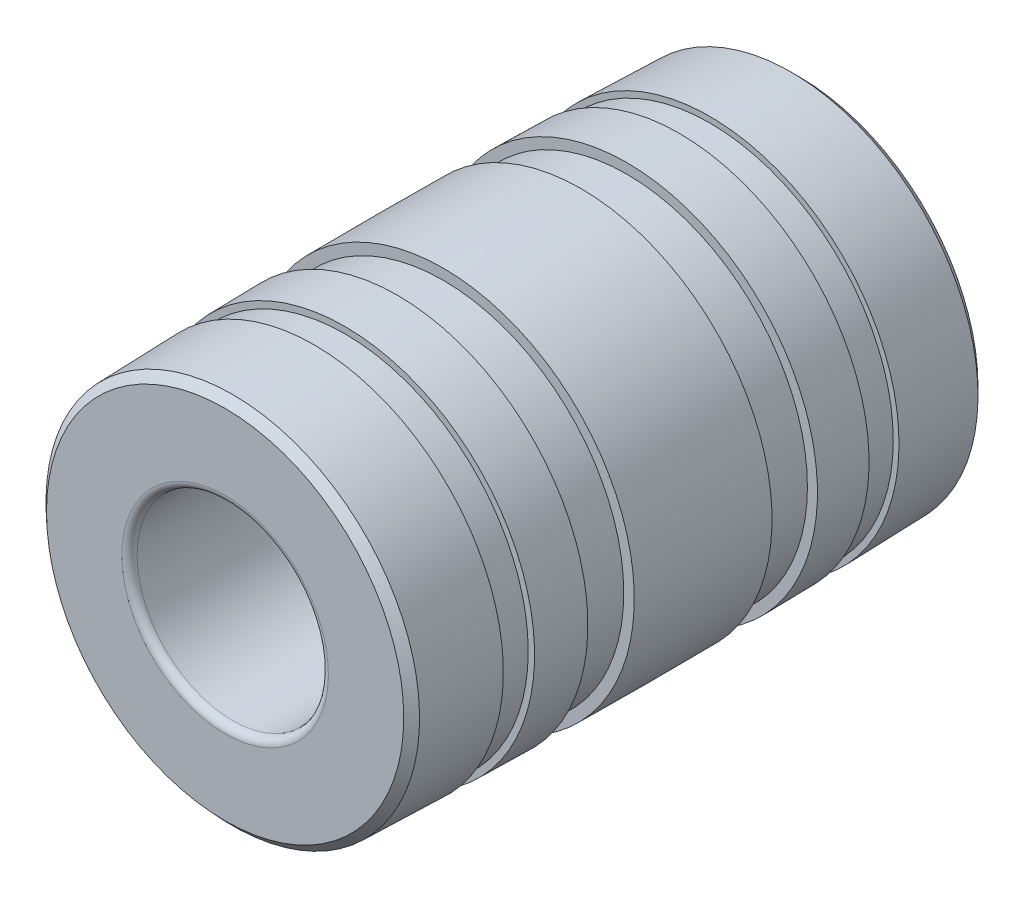
ISO-10303-21;
HEADER;
FILE_DESCRIPTION(('STEP AP214'),'2;1');
FILE_NAME('part.step','',(''),(''),'','','');
FILE_SCHEMA(('AUTOMOTIVE_DESIGN { 1 0 10303 214 1 1 1 1 }'));
ENDSEC;
DATA;
#1=APPLICATION_CONTEXT('core data for automotive mechanical design processes');
#2=APPLICATION_PROTOCOL_DEFINITION('international standard','automotive_design',2000,#1);
#3=PRODUCT_CONTEXT('',#1,'mechanical');
#4=PRODUCT('Part','Part','',(#3));
#5=PRODUCT_RELATED_PRODUCT_CATEGORY('part','',(#4));
#6=PRODUCT_DEFINITION_FORMATION('','',#4);
#7=PRODUCT_DEFINITION_CONTEXT('part definition',#1,'design');
#8=PRODUCT_DEFINITION('design','',#6,#7);
#9=PRODUCT_DEFINITION_SHAPE('','',#8);
#10=(LENGTH_UNIT() NAMED_UNIT(*) SI_UNIT(.MILLI.,.METRE.));
#11=(NAMED_UNIT(*) PLANE_ANGLE_UNIT() SI_UNIT($,.RADIAN.));
#12=(NAMED_UNIT(*) SI_UNIT($,.STERADIAN.) SOLID_ANGLE_UNIT());
#13=UNCERTAINTY_MEASURE_WITH_UNIT(LENGTH_MEASURE(1.E-05),#10,'distance_accuracy_value','');
#14=(GEOMETRIC_REPRESENTATION_CONTEXT(3) GLOBAL_UNCERTAINTY_ASSIGNED_CONTEXT((#13)) GLOBAL_UNIT_ASSIGNED_CONTEXT((#10,
#11,#12)) REPRESENTATION_CONTEXT('',''));
#15=CARTESIAN_POINT('',(0.,0.,0.));
#16=DIRECTION('',(0.,0.,1.));
#17=DIRECTION('',(1.,0.,0.));
#18=AXIS2_PLACEMENT_3D('',#15,#16,#17);
#19=CARTESIAN_POINT('',(0.,0.,9.52499999999993));
#20=DIRECTION('',(0.,0.,1.));
#21=DIRECTION('',(0.,-1.,0.));
#22=AXIS2_PLACEMENT_3D('',#19,#20,#21);
#23=PLANE('',#22);
#24=CARTESIAN_POINT('',(0.,0.,9.52499999999993));
#25=DIRECTION('',(0.,0.,1.));
#26=DIRECTION('',(0.,-1.,0.));
#27=AXIS2_PLACEMENT_3D('',#24,#25,#26);
#28=CIRCLE('',#27,3.429);
#29=CARTESIAN_POINT('',(0.,-3.429,9.52499999999993));
#30=VERTEX_POINT('',#29);
#31=EDGE_CURVE('E10',#30,#30,#28,.F.);
#32=ORIENTED_EDGE('',*,*,#31,.T.);
#33=EDGE_LOOP('',(#32));
#34=FACE_BOUND('',#33,.T.);
#35=CARTESIAN_POINT('',(0.,0.,9.52499999999993));
#36=DIRECTION('',(0.,0.,1.));
#37=DIRECTION('',(0.,-1.,0.));
#38=AXIS2_PLACEMENT_3D('',#35,#36,#37);
#39=CIRCLE('',#38,5.92834284277033);
#40=CARTESIAN_POINT('',(0.,-5.92834284277032,9.52499999999993));
#41=VERTEX_POINT('',#40);
#42=EDGE_CURVE('E55',#41,#41,#39,.T.);
#43=ORIENTED_EDGE('',*,*,#42,.T.);
#44=EDGE_LOOP('',(#43));
#45=FACE_BOUND('',#44,.T.);
#46=ADVANCED_FACE('F32',(#34,#45),#23,.T.);
#47=CARTESIAN_POINT('',(0.,0.,-9.525));
#48=DIRECTION('',(0.,0.,-1.));
#49=DIRECTION('',(0.,1.,0.));
#50=AXIS2_PLACEMENT_3D('',#47,#48,#49);
#51=PLANE('',#50);
#52=CARTESIAN_POINT('',(0.,0.,-9.525));
#53=DIRECTION('',(0.,0.,-1.));
#54=DIRECTION('',(0.,1.,0.));
#55=AXIS2_PLACEMENT_3D('',#52,#53,#54);
#56=CIRCLE('',#55,3.429);
#57=CARTESIAN_POINT('',(0.,3.429,-9.525));
#58=VERTEX_POINT('',#57);
#59=EDGE_CURVE('E47',#58,#58,#56,.F.);
#60=ORIENTED_EDGE('',*,*,#59,.T.);
#61=EDGE_LOOP('',(#60));
#62=FACE_BOUND('',#61,.T.);
#63=CARTESIAN_POINT('',(0.,0.,-9.525));
#64=DIRECTION('',(0.,0.,-1.));
#65=DIRECTION('',(0.,1.,0.));
#66=AXIS2_PLACEMENT_3D('',#63,#64,#65);
#67=CIRCLE('',#66,5.93725000000012);
#68=CARTESIAN_POINT('',(0.,5.93725000000011,-9.525));
#69=VERTEX_POINT('',#68);
#70=EDGE_CURVE('E58',#69,#69,#67,.T.);
#71=ORIENTED_EDGE('',*,*,#70,.T.);
#72=EDGE_LOOP('',(#71));
#73=FACE_BOUND('',#72,.T.);
#74=ADVANCED_FACE('F131',(#62,#73),#51,.T.);
#75=CARTESIAN_POINT('',(0.,0.,1.64659045136589E-13));
#76=DIRECTION('',(0.,0.,1.));
#77=DIRECTION('',(0.,-1.,0.));
#78=AXIS2_PLACEMENT_3D('',#75,#76,#77);
#79=DEGENERATE_TOROIDAL_SURFACE('',#78,279.479375000001,285.829375,.F.);
#80=CARTESIAN_POINT('',(0.,0.,-9.26236389053507));
#81=DIRECTION('',(0.,0.,1.));
#82=DIRECTION('',(0.,-1.,0.));
#83=AXIS2_PLACEMENT_3D('',#80,#81,#82);
#84=CIRCLE('',#83,6.199886109465);
#85=CARTESIAN_POINT('',(0.,-6.199886109465,-9.26236389053507));
#86=VERTEX_POINT('',#85);
#87=EDGE_CURVE('E61',#86,#86,#84,.T.);
#88=ORIENTED_EDGE('',*,*,#87,.T.);
#89=EDGE_LOOP('',(#88));
#90=FACE_BOUND('',#89,.T.);
#91=CARTESIAN_POINT('',(0.,0.,-6.56589999999983));
#92=DIRECTION('',(0.,0.,1.));
#93=DIRECTION('',(0.,-1.,0.));
#94=AXIS2_PLACEMENT_3D('',#91,#92,#93);
#95=CIRCLE('',#94,6.27457610143373);
#96=CARTESIAN_POINT('',(0.,-6.27457610143375,-6.56589999999982));
#97=VERTEX_POINT('',#96);
#98=EDGE_CURVE('E64',#97,#97,#95,.T.);
#99=ORIENTED_EDGE('',*,*,#98,.F.);
#100=EDGE_LOOP('',(#99));
#101=FACE_BOUND('',#100,.T.);
#102=ADVANCED_FACE('F136',(#90,#101),#79,.F.);
#103=CARTESIAN_POINT('',(0.,6.27457610143366,-6.56589999999992));
#104=DIRECTION('',(0.,0.,1.));
#105=DIRECTION('',(0.,-1.,0.));
#106=AXIS2_PLACEMENT_3D('',#103,#104,#105);
#107=PLANE('',#106);
#108=ORIENTED_EDGE('',*,*,#98,.T.);
#109=EDGE_LOOP('',(#108));
#110=FACE_BOUND('',#109,.T.);
#111=CARTESIAN_POINT('',(0.,0.,-6.5659));
#112=DIRECTION('',(0.,0.,1.));
#113=DIRECTION('',(0.,-1.,0.));
#114=AXIS2_PLACEMENT_3D('',#111,#112,#113);
#115=CIRCLE('',#114,6.08407610143368);
#116=CARTESIAN_POINT('',(0.,-6.08407610143369,-6.5659));
#117=VERTEX_POINT('',#116);
#118=EDGE_CURVE('E67',#117,#117,#115,.T.);
#119=ORIENTED_EDGE('',*,*,#118,.F.);
#120=EDGE_LOOP('',(#119));
#121=FACE_BOUND('',#120,.T.);
#122=ADVANCED_FACE('F165',(#110,#121),#107,.T.);
#123=CARTESIAN_POINT('',(0.,0.,9.525));
#124=DIRECTION('',(0.,0.,1.));
#125=DIRECTION('',(0.,-1.,0.));
#126=AXIS2_PLACEMENT_3D('',#123,#124,#125);
#127=CYLINDRICAL_SURFACE('',#126,6.08407610143368);
#128=ORIENTED_EDGE('',*,*,#118,.T.);
#129=EDGE_LOOP('',(#128));
#130=FACE_BOUND('',#129,.T.);
#131=CARTESIAN_POINT('',(0.,0.,-5.5499));
#132=DIRECTION('',(0.,0.,1.));
#133=DIRECTION('',(0.,-1.,0.));
#134=AXIS2_PLACEMENT_3D('',#131,#132,#133);
#135=CIRCLE('',#134,6.08407610143368);
#136=CARTESIAN_POINT('',(0.,-6.08407610143369,-5.5499));
#137=VERTEX_POINT('',#136);
#138=EDGE_CURVE('E70',#137,#137,#135,.T.);
#139=ORIENTED_EDGE('',*,*,#138,.F.);
#140=EDGE_LOOP('',(#139));
#141=FACE_BOUND('',#140,.T.);
#142=ADVANCED_FACE('F170',(#130,#141),#127,.T.);
#143=CARTESIAN_POINT('',(0.,6.08407610143366,-5.5499));
#144=DIRECTION('',(0.,0.,-1.));
#145=DIRECTION('',(0.,1.,0.));
#146=AXIS2_PLACEMENT_3D('',#143,#144,#145);
#147=PLANE('',#146);
#148=ORIENTED_EDGE('',*,*,#138,.T.);
#149=EDGE_LOOP('',(#148));
#150=FACE_BOUND('',#149,.T.);
#151=CARTESIAN_POINT('',(0.,0.,-5.5499));
#152=DIRECTION('',(0.,0.,1.));
#153=DIRECTION('',(0.,-1.,0.));
#154=AXIS2_PLACEMENT_3D('',#151,#152,#153);
#155=CIRCLE('',#154,6.2961141919189);
#156=CARTESIAN_POINT('',(0.,-6.29611419191891,-5.5499));
#157=VERTEX_POINT('',#156);
#158=EDGE_CURVE('E73',#157,#157,#155,.T.);
#159=ORIENTED_EDGE('',*,*,#158,.F.);
#160=EDGE_LOOP('',(#159));
#161=FACE_BOUND('',#160,.T.);
#162=ADVANCED_FACE('F176',(#150,#161),#147,.T.);
#163=CARTESIAN_POINT('',(0.,0.,1.64659045136589E-13));
#164=DIRECTION('',(0.,0.,1.));
#165=DIRECTION('',(0.,-1.,0.));
#166=AXIS2_PLACEMENT_3D('',#163,#164,#165);
#167=DEGENERATE_TOROIDAL_SURFACE('',#166,279.479375000001,285.829375,.F.);
#168=ORIENTED_EDGE('',*,*,#158,.T.);
#169=EDGE_LOOP('',(#168));
#170=FACE_BOUND('',#169,.T.);
#171=CARTESIAN_POINT('',(0.,0.,-3.80999999999995));
#172=DIRECTION('',(0.,0.,1.));
#173=DIRECTION('',(0.,-1.,0.));
#174=AXIS2_PLACEMENT_3D('',#171,#172,#173);
#175=CIRCLE('',#174,6.32460592554724);
#176=CARTESIAN_POINT('',(0.,-6.32460592554725,-3.80999999999995));
#177=VERTEX_POINT('',#176);
#178=EDGE_CURVE('E76',#177,#177,#175,.T.);
#179=ORIENTED_EDGE('',*,*,#178,.F.);
#180=EDGE_LOOP('',(#179));
#181=FACE_BOUND('',#180,.T.);
#182=ADVANCED_FACE('F182',(#170,#181),#167,.F.);
#183=CARTESIAN_POINT('',(0.,5.9912309255473,-3.80999999999998));
#184=DIRECTION('',(0.,0.,1.));
#185=DIRECTION('',(0.,-1.,0.));
#186=AXIS2_PLACEMENT_3D('',#183,#184,#185);
#187=PLANE('',#186);
#188=ORIENTED_EDGE('',*,*,#178,.T.);
#189=EDGE_LOOP('',(#188));
#190=FACE_BOUND('',#189,.T.);
#191=CARTESIAN_POINT('',(0.,0.,-3.81000000000001));
#192=DIRECTION('',(0.,0.,1.));
#193=DIRECTION('',(0.,-1.,0.));
#194=AXIS2_PLACEMENT_3D('',#191,#192,#193);
#195=CIRCLE('',#194,5.99123092554732);
#196=CARTESIAN_POINT('',(0.,-5.99123092554733,-3.81));
#197=VERTEX_POINT('',#196);
#198=EDGE_CURVE('E79',#197,#197,#195,.T.);
#199=ORIENTED_EDGE('',*,*,#198,.F.);
#200=EDGE_LOOP('',(#199));
#201=FACE_BOUND('',#200,.T.);
#202=ADVANCED_FACE('F188',(#190,#201),#187,.T.);
#203=CARTESIAN_POINT('',(0.,0.,9.525));
#204=DIRECTION('',(0.,0.,1.));
#205=DIRECTION('',(0.,-1.,0.));
#206=AXIS2_PLACEMENT_3D('',#203,#204,#205);
#207=CYLINDRICAL_SURFACE('',#206,5.99123092554732);
#208=ORIENTED_EDGE('',*,*,#198,.T.);
#209=EDGE_LOOP('',(#208));
#210=FACE_BOUND('',#209,.T.);
#211=CARTESIAN_POINT('',(0.,0.,-2.286));
#212=DIRECTION('',(0.,0.,1.));
#213=DIRECTION('',(0.,-1.,0.));
#214=AXIS2_PLACEMENT_3D('',#211,#212,#213);
#215=CIRCLE('',#214,5.99123092554732);
#216=CARTESIAN_POINT('',(0.,-5.99123092554733,-2.286));
#217=VERTEX_POINT('',#216);
#218=EDGE_CURVE('E82',#217,#217,#215,.T.);
#219=ORIENTED_EDGE('',*,*,#218,.F.);
#220=EDGE_LOOP('',(#219));
#221=FACE_BOUND('',#220,.T.);
#222=ADVANCED_FACE('F194',(#210,#221),#207,.T.);
#223=CARTESIAN_POINT('',(0.,6.3408583931076,-2.286));
#224=DIRECTION('',(0.,0.,-1.));
#225=DIRECTION('',(0.,1.,0.));
#226=AXIS2_PLACEMENT_3D('',#223,#224,#225);
#227=PLANE('',#226);
#228=ORIENTED_EDGE('',*,*,#218,.T.);
#229=EDGE_LOOP('',(#228));
#230=FACE_BOUND('',#229,.T.);
#231=CARTESIAN_POINT('',(0.,0.,-2.286));
#232=DIRECTION('',(0.,0.,1.));
#233=DIRECTION('',(0.,-1.,0.));
#234=AXIS2_PLACEMENT_3D('',#231,#232,#233);
#235=CIRCLE('',#234,6.34085839310762);
#236=CARTESIAN_POINT('',(0.,-6.34085839310763,-2.286));
#237=VERTEX_POINT('',#236);
#238=EDGE_CURVE('E85',#237,#237,#235,.T.);
#239=ORIENTED_EDGE('',*,*,#238,.F.);
#240=EDGE_LOOP('',(#239));
#241=FACE_BOUND('',#240,.T.);
#242=ADVANCED_FACE('F200',(#230,#241),#227,.T.);
#243=CARTESIAN_POINT('',(0.,0.,1.64659045136589E-13));
#244=DIRECTION('',(0.,0.,1.));
#245=DIRECTION('',(0.,-1.,0.));
#246=AXIS2_PLACEMENT_3D('',#243,#244,#245);
#247=DEGENERATE_TOROIDAL_SURFACE('',#246,279.479375000001,285.829375,.F.);
#248=ORIENTED_EDGE('',*,*,#238,.T.);
#249=EDGE_LOOP('',(#248));
#250=FACE_BOUND('',#249,.T.);
#251=CARTESIAN_POINT('',(0.,0.,2.28600000000001));
#252=DIRECTION('',(0.,0.,1.));
#253=DIRECTION('',(0.,-1.,0.));
#254=AXIS2_PLACEMENT_3D('',#251,#252,#253);
#255=CIRCLE('',#254,6.34085839310773);
#256=CARTESIAN_POINT('',(0.,-6.34085839310774,2.28600000000002));
#257=VERTEX_POINT('',#256);
#258=EDGE_CURVE('E88',#257,#257,#255,.T.);
#259=ORIENTED_EDGE('',*,*,#258,.F.);
#260=EDGE_LOOP('',(#259));
#261=FACE_BOUND('',#260,.T.);
#262=ADVANCED_FACE('F206',(#250,#261),#247,.F.);
#263=CARTESIAN_POINT('',(0.,5.99123092554731,2.286));
#264=DIRECTION('',(0.,0.,1.));
#265=DIRECTION('',(0.,-1.,0.));
#266=AXIS2_PLACEMENT_3D('',#263,#264,#265);
#267=PLANE('',#266);
#268=ORIENTED_EDGE('',*,*,#258,.T.);
#269=EDGE_LOOP('',(#268));
#270=FACE_BOUND('',#269,.T.);
#271=CARTESIAN_POINT('',(0.,0.,2.286));
#272=DIRECTION('',(0.,0.,1.));
#273=DIRECTION('',(0.,-1.,0.));
#274=AXIS2_PLACEMENT_3D('',#271,#272,#273);
#275=CIRCLE('',#274,5.99123092554732);
#276=CARTESIAN_POINT('',(0.,-5.99123092554733,2.286));
#277=VERTEX_POINT('',#276);
#278=EDGE_CURVE('E91',#277,#277,#275,.T.);
#279=ORIENTED_EDGE('',*,*,#278,.F.);
#280=EDGE_LOOP('',(#279));
#281=FACE_BOUND('',#280,.T.);
#282=ADVANCED_FACE('F212',(#270,#281),#267,.T.);
#283=CARTESIAN_POINT('',(0.,0.,9.525));
#284=DIRECTION('',(0.,0.,1.));
#285=DIRECTION('',(0.,-1.,0.));
#286=AXIS2_PLACEMENT_3D('',#283,#284,#285);
#287=CYLINDRICAL_SURFACE('',#286,5.99123092554732);
#288=ORIENTED_EDGE('',*,*,#278,.T.);
#289=EDGE_LOOP('',(#288));
#290=FACE_BOUND('',#289,.T.);
#291=CARTESIAN_POINT('',(0.,0.,3.81));
#292=DIRECTION('',(0.,0.,1.));
#293=DIRECTION('',(0.,-1.,0.));
#294=AXIS2_PLACEMENT_3D('',#291,#292,#293);
#295=CIRCLE('',#294,5.99123092554732);
#296=CARTESIAN_POINT('',(0.,-5.99123092554733,3.81));
#297=VERTEX_POINT('',#296);
#298=EDGE_CURVE('E94',#297,#297,#295,.T.);
#299=ORIENTED_EDGE('',*,*,#298,.F.);
#300=EDGE_LOOP('',(#299));
#301=FACE_BOUND('',#300,.T.);
#302=ADVANCED_FACE('F218',(#290,#301),#287,.T.);
#303=CARTESIAN_POINT('',(0.,6.32460592554731,3.81));
#304=DIRECTION('',(0.,0.,-1.));
#305=DIRECTION('',(0.,1.,0.));
#306=AXIS2_PLACEMENT_3D('',#303,#304,#305);
#307=PLANE('',#306);
#308=ORIENTED_EDGE('',*,*,#298,.T.);
#309=EDGE_LOOP('',(#308));
#310=FACE_BOUND('',#309,.T.);
#311=CARTESIAN_POINT('',(0.,0.,3.81));
#312=DIRECTION('',(0.,0.,1.));
#313=DIRECTION('',(0.,-1.,0.));
#314=AXIS2_PLACEMENT_3D('',#311,#312,#313);
#315=CIRCLE('',#314,6.32460592554732);
#316=CARTESIAN_POINT('',(0.,-6.32460592554733,3.81));
#317=VERTEX_POINT('',#316);
#318=EDGE_CURVE('E97',#317,#317,#315,.T.);
#319=ORIENTED_EDGE('',*,*,#318,.F.);
#320=EDGE_LOOP('',(#319));
#321=FACE_BOUND('',#320,.T.);
#322=ADVANCED_FACE('F224',(#310,#321),#307,.T.);
#323=CARTESIAN_POINT('',(0.,0.,1.64659045136589E-13));
#324=DIRECTION('',(0.,0.,1.));
#325=DIRECTION('',(0.,-1.,0.));
#326=AXIS2_PLACEMENT_3D('',#323,#324,#325);
#327=DEGENERATE_TOROIDAL_SURFACE('',#326,279.479375000001,285.829375,.F.);
#328=ORIENTED_EDGE('',*,*,#318,.T.);
#329=EDGE_LOOP('',(#328));
#330=FACE_BOUND('',#329,.T.);
#331=CARTESIAN_POINT('',(0.,0.,5.54989999999986));
#332=DIRECTION('',(0.,0.,1.));
#333=DIRECTION('',(0.,-1.,0.));
#334=AXIS2_PLACEMENT_3D('',#331,#332,#333);
#335=CIRCLE('',#334,6.29611419191896);
#336=CARTESIAN_POINT('',(0.,-6.29611419191897,5.54989999999987));
#337=VERTEX_POINT('',#336);
#338=EDGE_CURVE('E100',#337,#337,#335,.T.);
#339=ORIENTED_EDGE('',*,*,#338,.F.);
#340=EDGE_LOOP('',(#339));
#341=FACE_BOUND('',#340,.T.);
#342=ADVANCED_FACE('F230',(#330,#341),#327,.F.);
#343=CARTESIAN_POINT('',(0.,6.08407610143368,5.54989999999992));
#344=DIRECTION('',(0.,0.,1.));
#345=DIRECTION('',(0.,-1.,0.));
#346=AXIS2_PLACEMENT_3D('',#343,#344,#345);
#347=PLANE('',#346);
#348=ORIENTED_EDGE('',*,*,#338,.T.);
#349=EDGE_LOOP('',(#348));
#350=FACE_BOUND('',#349,.T.);
#351=CARTESIAN_POINT('',(0.,0.,5.54989999999999));
#352=DIRECTION('',(0.,0.,1.));
#353=DIRECTION('',(0.,-1.,0.));
#354=AXIS2_PLACEMENT_3D('',#351,#352,#353);
#355=CIRCLE('',#354,6.08407610143369);
#356=CARTESIAN_POINT('',(0.,-6.08407610143369,5.5499));
#357=VERTEX_POINT('',#356);
#358=EDGE_CURVE('E103',#357,#357,#355,.T.);
#359=ORIENTED_EDGE('',*,*,#358,.F.);
#360=EDGE_LOOP('',(#359));
#361=FACE_BOUND('',#360,.T.);
#362=ADVANCED_FACE('F127',(#350,#361),#347,.T.);
#363=CARTESIAN_POINT('',(0.,0.,9.525));
#364=DIRECTION('',(0.,0.,1.));
#365=DIRECTION('',(0.,-1.,0.));
#366=AXIS2_PLACEMENT_3D('',#363,#364,#365);
#367=CYLINDRICAL_SURFACE('',#366,6.08407610143369);
#368=ORIENTED_EDGE('',*,*,#358,.T.);
#369=EDGE_LOOP('',(#368));
#370=FACE_BOUND('',#369,.T.);
#371=CARTESIAN_POINT('',(0.,0.,6.5659));
#372=DIRECTION('',(0.,0.,1.));
#373=DIRECTION('',(0.,-1.,0.));
#374=AXIS2_PLACEMENT_3D('',#371,#372,#373);
#375=CIRCLE('',#374,6.08407610143369);
#376=CARTESIAN_POINT('',(0.,-6.08407610143369,6.5659));
#377=VERTEX_POINT('',#376);
#378=EDGE_CURVE('E106',#377,#377,#375,.T.);
#379=ORIENTED_EDGE('',*,*,#378,.F.);
#380=EDGE_LOOP('',(#379));
#381=FACE_BOUND('',#380,.T.);
#382=ADVANCED_FACE('F117',(#370,#381),#367,.T.);
#383=CARTESIAN_POINT('',(0.,6.27457610143368,6.56589999999999));
#384=DIRECTION('',(0.,0.,-1.));
#385=DIRECTION('',(0.,1.,0.));
#386=AXIS2_PLACEMENT_3D('',#383,#384,#385);
#387=PLANE('',#386);
#388=ORIENTED_EDGE('',*,*,#378,.T.);
#389=EDGE_LOOP('',(#388));
#390=FACE_BOUND('',#389,.T.);
#391=CARTESIAN_POINT('',(0.,0.,6.5659));
#392=DIRECTION('',(0.,0.,1.));
#393=DIRECTION('',(0.,-1.,0.));
#394=AXIS2_PLACEMENT_3D('',#391,#392,#393);
#395=CIRCLE('',#394,6.27457610143369);
#396=CARTESIAN_POINT('',(0.,-6.27457610143369,6.5659));
#397=VERTEX_POINT('',#396);
#398=EDGE_CURVE('E109',#397,#397,#395,.T.);
#399=ORIENTED_EDGE('',*,*,#398,.F.);
#400=EDGE_LOOP('',(#399));
#401=FACE_BOUND('',#400,.T.);
#402=ADVANCED_FACE('F115',(#390,#401),#387,.T.);
#403=CARTESIAN_POINT('',(0.,0.,1.64659045136589E-13));
#404=DIRECTION('',(0.,0.,1.));
#405=DIRECTION('',(0.,-1.,0.));
#406=AXIS2_PLACEMENT_3D('',#403,#404,#405);
#407=DEGENERATE_TOROIDAL_SURFACE('',#406,279.479375000001,285.829375,.F.);
#408=CARTESIAN_POINT('',(0.,0.,9.27125000914575));
#409=DIRECTION('',(0.,0.,-1.));
#410=DIRECTION('',(0.,1.,0.));
#411=AXIS2_PLACEMENT_3D('',#408,#409,#410);
#412=CIRCLE('',#411,6.19959786317467);
#413=CARTESIAN_POINT('',(0.,6.19959786317468,9.27125000914575));
#414=VERTEX_POINT('',#413);
#415=EDGE_CURVE('E52',#414,#414,#412,.T.);
#416=ORIENTED_EDGE('',*,*,#415,.T.);
#417=EDGE_LOOP('',(#416));
#418=FACE_BOUND('',#417,.T.);
#419=ORIENTED_EDGE('',*,*,#398,.T.);
#420=EDGE_LOOP('',(#419));
#421=FACE_BOUND('',#420,.T.);
#422=ADVANCED_FACE('F113',(#418,#421),#407,.F.);
#423=CARTESIAN_POINT('',(0.,0.,-9.52500000000001));
#424=DIRECTION('',(0.,0.,1.));
#425=DIRECTION('',(1.,0.,0.));
#426=AXIS2_PLACEMENT_3D('',#423,#424,#425);
#427=CYLINDRICAL_SURFACE('',#426,3.175);
#428=CARTESIAN_POINT('',(0.,0.,-9.271));
#429=DIRECTION('',(0.,0.,-1.));
#430=DIRECTION('',(0.,1.,0.));
#431=AXIS2_PLACEMENT_3D('',#428,#429,#430);
#432=CIRCLE('',#431,3.175);
#433=CARTESIAN_POINT('',(0.,3.175,-9.271));
#434=VERTEX_POINT('',#433);
#435=EDGE_CURVE('E39',#434,#434,#432,.T.);
#436=ORIENTED_EDGE('',*,*,#435,.T.);
#437=EDGE_LOOP('',(#436));
#438=FACE_BOUND('',#437,.T.);
#439=CARTESIAN_POINT('',(0.,0.,9.27099999999993));
#440=DIRECTION('',(0.,0.,1.));
#441=DIRECTION('',(0.,-1.,0.));
#442=AXIS2_PLACEMENT_3D('',#439,#440,#441);
#443=CIRCLE('',#442,3.175);
#444=CARTESIAN_POINT('',(0.,-3.175,9.27099999999993));
#445=VERTEX_POINT('',#444);
#446=EDGE_CURVE('E43',#445,#445,#443,.T.);
#447=ORIENTED_EDGE('',*,*,#446,.T.);
#448=EDGE_LOOP('',(#447));
#449=FACE_BOUND('',#448,.T.);
#450=ADVANCED_FACE('F124',(#438,#449),#427,.F.);
#451=CARTESIAN_POINT('',(0.,0.,-9.26236389053513));
#452=DIRECTION('',(0.,0.,1.));
#453=DIRECTION('',(0.,-1.,0.));
#454=AXIS2_PLACEMENT_3D('',#451,#452,#453);
#455=CONICAL_SURFACE('',#454,6.19988610946498,0.785398163397438);
#456=ORIENTED_EDGE('',*,*,#70,.F.);
#457=EDGE_LOOP('',(#456));
#458=FACE_BOUND('',#457,.T.);
#459=ORIENTED_EDGE('',*,*,#87,.F.);
#460=EDGE_LOOP('',(#459));
#461=FACE_BOUND('',#460,.T.);
#462=ADVANCED_FACE('F142',(#458,#461),#455,.T.);
#463=CARTESIAN_POINT('',(0.,0.,9.52499999999993));
#464=DIRECTION('',(0.,0.,-1.));
#465=DIRECTION('',(0.,1.,0.));
#466=AXIS2_PLACEMENT_3D('',#463,#464,#465);
#467=CONICAL_SURFACE('',#466,5.92834284277033,0.818728410825274);
#468=ORIENTED_EDGE('',*,*,#415,.F.);
#469=EDGE_LOOP('',(#468));
#470=FACE_BOUND('',#469,.T.);
#471=ORIENTED_EDGE('',*,*,#42,.F.);
#472=EDGE_LOOP('',(#471));
#473=FACE_BOUND('',#472,.T.);
#474=ADVANCED_FACE('F145',(#470,#473),#467,.T.);
#475=CARTESIAN_POINT('',(0.,0.,-9.271));
#476=DIRECTION('',(0.,0.,-1.));
#477=DIRECTION('',(0.,1.,0.));
#478=AXIS2_PLACEMENT_3D('',#475,#476,#477);
#479=TOROIDAL_SURFACE('',#478,3.429,0.254);
#480=ORIENTED_EDGE('',*,*,#435,.F.);
#481=EDGE_LOOP('',(#480));
#482=FACE_BOUND('',#481,.T.);
#483=ORIENTED_EDGE('',*,*,#59,.F.);
#484=EDGE_LOOP('',(#483));
#485=FACE_BOUND('',#484,.T.);
#486=ADVANCED_FACE('F148',(#482,#485),#479,.T.);
#487=CARTESIAN_POINT('',(0.,0.,9.27099999999993));
#488=DIRECTION('',(0.,0.,1.));
#489=DIRECTION('',(0.,-1.,0.));
#490=AXIS2_PLACEMENT_3D('',#487,#488,#489);
#491=TOROIDAL_SURFACE('',#490,3.429,0.254);
#492=ORIENTED_EDGE('',*,*,#31,.F.);
#493=EDGE_LOOP('',(#492));
#494=FACE_BOUND('',#493,.T.);
#495=ORIENTED_EDGE('',*,*,#446,.F.);
#496=EDGE_LOOP('',(#495));
#497=FACE_BOUND('',#496,.T.);
#498=ADVANCED_FACE('F34',(#494,#497),#491,.T.);
#499=CLOSED_SHELL('',(#46,#74,#102,#122,#142,#162,#182,#202,#222,#242,#262,#282,#302,#322,#342,
#362,#382,#402,#422,#450,#462,#474,#486,#498));
#500=MANIFOLD_SOLID_BREP('B2',#499);
#501=ADVANCED_BREP_SHAPE_REPRESENTATION('',(#18,#500),#14);
#502=SHAPE_DEFINITION_REPRESENTATION(#9,#501);
ENDSEC;
END-ISO-10303-21;
